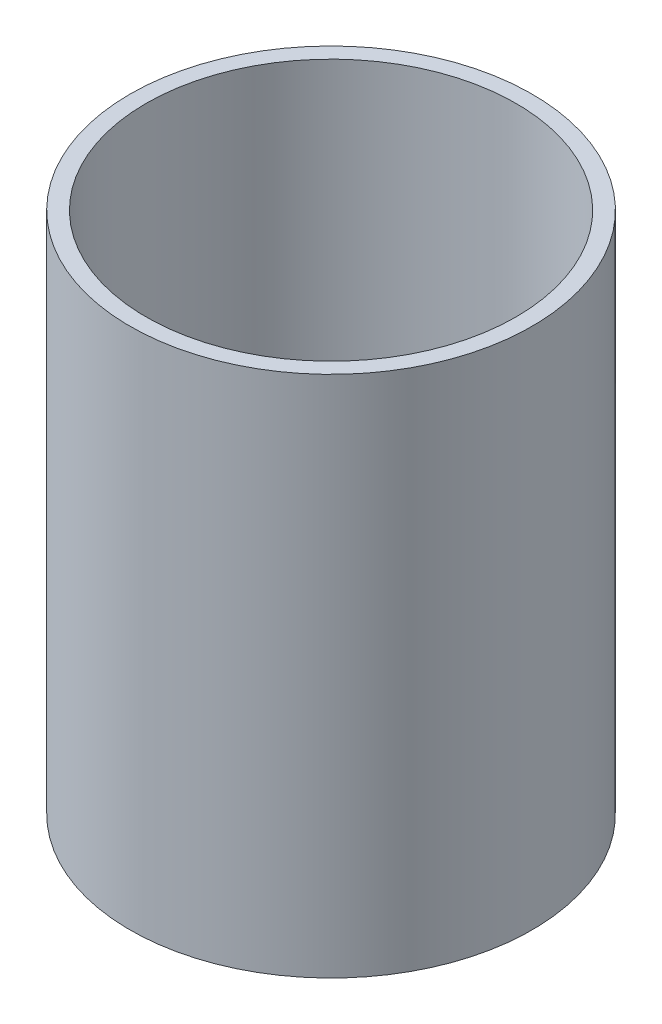
ISO-10303-21;
HEADER;
FILE_DESCRIPTION(('STEP AP214'),'2;1');
FILE_NAME('part.step','',(''),(''),'','','');
FILE_SCHEMA(('AUTOMOTIVE_DESIGN { 1 0 10303 214 1 1 1 1 }'));
ENDSEC;
DATA;
#1=APPLICATION_CONTEXT('core data for automotive mechanical design processes');
#2=APPLICATION_PROTOCOL_DEFINITION('international standard','automotive_design',2000,#1);
#3=PRODUCT_CONTEXT('',#1,'mechanical');
#4=PRODUCT('Part','Part','',(#3));
#5=PRODUCT_RELATED_PRODUCT_CATEGORY('part','',(#4));
#6=PRODUCT_DEFINITION_FORMATION('','',#4);
#7=PRODUCT_DEFINITION_CONTEXT('part definition',#1,'design');
#8=PRODUCT_DEFINITION('design','',#6,#7);
#9=PRODUCT_DEFINITION_SHAPE('','',#8);
#10=(LENGTH_UNIT() NAMED_UNIT(*) SI_UNIT(.MILLI.,.METRE.));
#11=(NAMED_UNIT(*) PLANE_ANGLE_UNIT() SI_UNIT($,.RADIAN.));
#12=(NAMED_UNIT(*) SI_UNIT($,.STERADIAN.) SOLID_ANGLE_UNIT());
#13=UNCERTAINTY_MEASURE_WITH_UNIT(LENGTH_MEASURE(1.E-05),#10,'distance_accuracy_value','');
#14=(GEOMETRIC_REPRESENTATION_CONTEXT(3) GLOBAL_UNCERTAINTY_ASSIGNED_CONTEXT((#13)) GLOBAL_UNIT_ASSIGNED_CONTEXT((#10,
#11,#12)) REPRESENTATION_CONTEXT('',''));
#15=CARTESIAN_POINT('',(0.,0.,0.));
#16=DIRECTION('',(0.,0.,1.));
#17=DIRECTION('',(1.,0.,0.));
#18=AXIS2_PLACEMENT_3D('',#15,#16,#17);
#19=CARTESIAN_POINT('',(0.,0.,0.));
#20=DIRECTION('',(0.,1.,0.));
#21=DIRECTION('',(-1.,0.,0.));
#22=AXIS2_PLACEMENT_3D('',#19,#20,#21);
#23=PLANE('',#22);
#24=CARTESIAN_POINT('',(0.,0.,0.));
#25=DIRECTION('',(0.,1.,0.));
#26=DIRECTION('',(-1.,0.,0.));
#27=AXIS2_PLACEMENT_3D('',#24,#25,#26);
#28=CIRCLE('',#27,50.);
#29=CARTESIAN_POINT('',(-50.,0.,0.));
#30=VERTEX_POINT('',#29);
#31=EDGE_CURVE('E10',#30,#30,#28,.T.);
#32=ORIENTED_EDGE('',*,*,#31,.F.);
#33=EDGE_LOOP('',(#32));
#34=FACE_BOUND('',#33,.T.);
#35=ADVANCED_FACE('F35',(#34),#23,.F.);
#36=CARTESIAN_POINT('',(0.,130.,0.));
#37=DIRECTION('',(0.,1.,0.));
#38=DIRECTION('',(-1.,0.,0.));
#39=AXIS2_PLACEMENT_3D('',#36,#37,#38);
#40=CYLINDRICAL_SURFACE('',#39,50.);
#41=CARTESIAN_POINT('',(0.,130.,0.));
#42=DIRECTION('',(0.,1.,0.));
#43=DIRECTION('',(-1.,0.,0.));
#44=AXIS2_PLACEMENT_3D('',#41,#42,#43);
#45=CIRCLE('',#44,50.);
#46=CARTESIAN_POINT('',(-50.,130.,0.));
#47=VERTEX_POINT('',#46);
#48=EDGE_CURVE('E41',#47,#47,#45,.T.);
#49=ORIENTED_EDGE('',*,*,#48,.F.);
#50=EDGE_LOOP('',(#49));
#51=FACE_BOUND('',#50,.T.);
#52=ORIENTED_EDGE('',*,*,#31,.T.);
#53=EDGE_LOOP('',(#52));
#54=FACE_BOUND('',#53,.T.);
#55=ADVANCED_FACE('F61',(#51,#54),#40,.T.);
#56=CARTESIAN_POINT('',(50.,130.,0.));
#57=DIRECTION('',(0.,-1.,0.));
#58=DIRECTION('',(1.,0.,0.));
#59=AXIS2_PLACEMENT_3D('',#56,#57,#58);
#60=PLANE('',#59);
#61=CARTESIAN_POINT('',(0.,130.,0.));
#62=DIRECTION('',(0.,-1.,0.));
#63=DIRECTION('',(1.,0.,0.));
#64=AXIS2_PLACEMENT_3D('',#61,#62,#63);
#65=CIRCLE('',#64,46.);
#66=CARTESIAN_POINT('',(46.,130.,0.));
#67=VERTEX_POINT('',#66);
#68=EDGE_CURVE('E49',#67,#67,#65,.F.);
#69=ORIENTED_EDGE('',*,*,#68,.F.);
#70=EDGE_LOOP('',(#69));
#71=FACE_BOUND('',#70,.T.);
#72=ORIENTED_EDGE('',*,*,#48,.T.);
#73=EDGE_LOOP('',(#72));
#74=FACE_BOUND('',#73,.T.);
#75=ADVANCED_FACE('F58',(#71,#74),#60,.F.);
#76=CARTESIAN_POINT('',(0.,4.,0.));
#77=DIRECTION('',(0.,1.,0.));
#78=DIRECTION('',(-1.,0.,0.));
#79=AXIS2_PLACEMENT_3D('',#76,#77,#78);
#80=PLANE('',#79);
#81=CARTESIAN_POINT('',(0.,4.,0.));
#82=DIRECTION('',(0.,1.,0.));
#83=DIRECTION('',(-1.,0.,0.));
#84=AXIS2_PLACEMENT_3D('',#81,#82,#83);
#85=CIRCLE('',#84,46.);
#86=CARTESIAN_POINT('',(-46.,4.,0.));
#87=VERTEX_POINT('',#86);
#88=EDGE_CURVE('E45',#87,#87,#85,.T.);
#89=ORIENTED_EDGE('',*,*,#88,.T.);
#90=EDGE_LOOP('',(#89));
#91=FACE_BOUND('',#90,.T.);
#92=ADVANCED_FACE('F60',(#91),#80,.T.);
#93=CARTESIAN_POINT('',(0.,130.,0.));
#94=DIRECTION('',(0.,1.,0.));
#95=DIRECTION('',(-1.,0.,0.));
#96=AXIS2_PLACEMENT_3D('',#93,#94,#95);
#97=CYLINDRICAL_SURFACE('',#96,46.);
#98=ORIENTED_EDGE('',*,*,#68,.T.);
#99=EDGE_LOOP('',(#98));
#100=FACE_BOUND('',#99,.T.);
#101=ORIENTED_EDGE('',*,*,#88,.F.);
#102=EDGE_LOOP('',(#101));
#103=FACE_BOUND('',#102,.T.);
#104=ADVANCED_FACE('F55',(#100,#103),#97,.F.);
#105=CLOSED_SHELL('',(#35,#55,#75,#92,#104));
#106=MANIFOLD_SOLID_BREP('B2',#105);
#107=ADVANCED_BREP_SHAPE_REPRESENTATION('',(#18,#106),#14);
#108=SHAPE_DEFINITION_REPRESENTATION(#9,#107);
ENDSEC;
END-ISO-10303-21;
